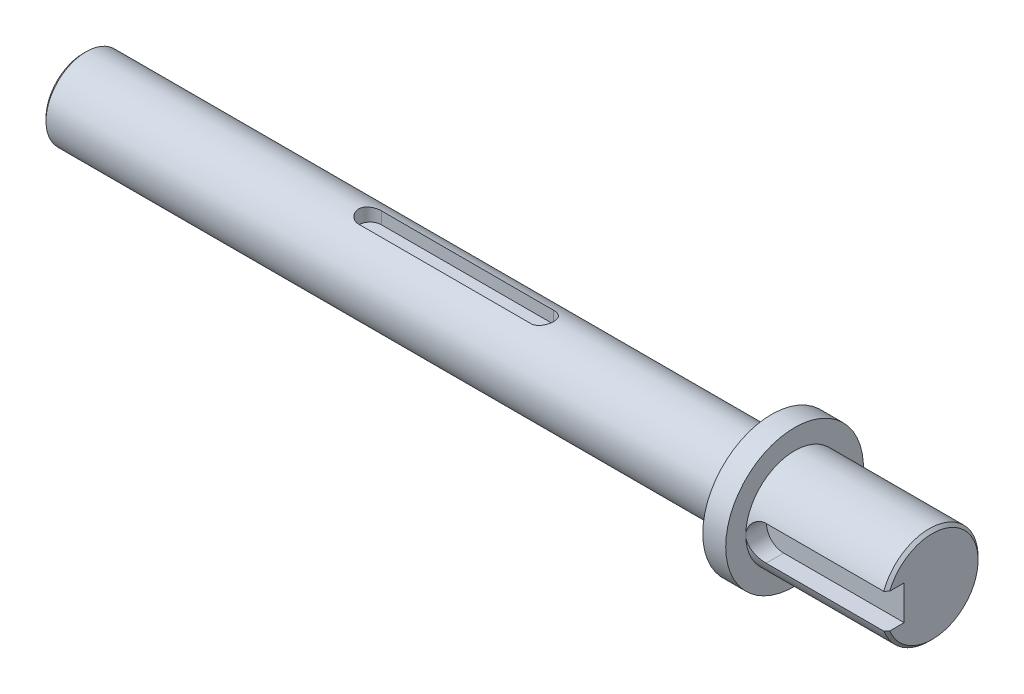
ISO-10303-21;
HEADER;
FILE_DESCRIPTION(('STEP AP214'),'2;1');
FILE_NAME('part.step','',(''),(''),'','','');
FILE_SCHEMA(('AUTOMOTIVE_DESIGN { 1 0 10303 214 1 1 1 1 }'));
ENDSEC;
DATA;
#1=APPLICATION_CONTEXT('core data for automotive mechanical design processes');
#2=APPLICATION_PROTOCOL_DEFINITION('international standard','automotive_design',2000,#1);
#3=PRODUCT_CONTEXT('',#1,'mechanical');
#4=PRODUCT('Part','Part','',(#3));
#5=PRODUCT_RELATED_PRODUCT_CATEGORY('part','',(#4));
#6=PRODUCT_DEFINITION_FORMATION('','',#4);
#7=PRODUCT_DEFINITION_CONTEXT('part definition',#1,'design');
#8=PRODUCT_DEFINITION('design','',#6,#7);
#9=PRODUCT_DEFINITION_SHAPE('','',#8);
#10=(LENGTH_UNIT() NAMED_UNIT(*) SI_UNIT(.MILLI.,.METRE.));
#11=(NAMED_UNIT(*) PLANE_ANGLE_UNIT() SI_UNIT($,.RADIAN.));
#12=(NAMED_UNIT(*) SI_UNIT($,.STERADIAN.) SOLID_ANGLE_UNIT());
#13=UNCERTAINTY_MEASURE_WITH_UNIT(LENGTH_MEASURE(1.E-05),#10,'distance_accuracy_value','');
#14=(GEOMETRIC_REPRESENTATION_CONTEXT(3) GLOBAL_UNCERTAINTY_ASSIGNED_CONTEXT((#13)) GLOBAL_UNIT_ASSIGNED_CONTEXT((#10,
#11,#12)) REPRESENTATION_CONTEXT('',''));
#15=CARTESIAN_POINT('',(0.,0.,0.));
#16=DIRECTION('',(0.,0.,1.));
#17=DIRECTION('',(1.,0.,0.));
#18=AXIS2_PLACEMENT_3D('',#15,#16,#17);
#19=CARTESIAN_POINT('',(61.9999999999998,0.,0.));
#20=DIRECTION('',(0.999999999999997,0.,0.));
#21=DIRECTION('',(0.,0.,-0.999999999999999));
#22=AXIS2_PLACEMENT_3D('',#19,#20,#21);
#23=PLANE('',#22);
#24=CARTESIAN_POINT('',(61.9999999999998,0.,0.));
#25=DIRECTION('',(0.999999999999997,0.,0.));
#26=DIRECTION('',(0.,0.,-0.999999999999999));
#27=AXIS2_PLACEMENT_3D('',#24,#25,#26);
#28=CIRCLE('',#27,6.);
#29=CARTESIAN_POINT('',(61.9999999999998,0.,6.00000000000001));
#30=VERTEX_POINT('',#29);
#31=EDGE_CURVE('E1997',#30,#30,#28,.T.);
#32=ORIENTED_EDGE('',*,*,#31,.T.);
#33=EDGE_LOOP('',(#32));
#34=FACE_BOUND('',#33,.T.);
#35=CARTESIAN_POINT('',(61.9999999999998,0.,0.));
#36=DIRECTION('',(0.999999999999997,0.,0.));
#37=DIRECTION('',(0.,0.,-0.999999999999999));
#38=AXIS2_PLACEMENT_3D('',#35,#36,#37);
#39=CIRCLE('',#38,4.25);
#40=CARTESIAN_POINT('',(61.9999999999998,0.,4.24999999999999));
#41=VERTEX_POINT('',#40);
#42=EDGE_CURVE('E1993',#41,#41,#39,.T.);
#43=ORIENTED_EDGE('',*,*,#42,.F.);
#44=EDGE_LOOP('',(#43));
#45=FACE_BOUND('',#44,.T.);
#46=ADVANCED_FACE('F1889',(#34,#45),#23,.T.);
#47=CARTESIAN_POINT('',(59.9999999999998,0.,0.));
#48=DIRECTION('',(-0.999999999999997,0.,0.));
#49=DIRECTION('',(0.,0.,0.999999999999999));
#50=AXIS2_PLACEMENT_3D('',#47,#48,#49);
#51=CYLINDRICAL_SURFACE('',#50,3.5);
#52=CARTESIAN_POINT('',(0.254000000000004,0.,0.));
#53=DIRECTION('',(0.999999999999997,0.,0.));
#54=DIRECTION('',(0.,1.,0.));
#55=AXIS2_PLACEMENT_3D('',#52,#53,#54);
#56=CIRCLE('',#55,3.5);
#57=CARTESIAN_POINT('',(0.254000000000004,3.50000000000001,0.));
#58=VERTEX_POINT('',#57);
#59=EDGE_CURVE('E1897',#58,#58,#56,.T.);
#60=ORIENTED_EDGE('',*,*,#59,.T.);
#61=EDGE_LOOP('',(#60));
#62=FACE_BOUND('',#61,.T.);
#63=DIRECTION('',(-0.999999999999997,0.,0.));
#64=VECTOR('',#63,1.);
#65=CARTESIAN_POINT('',(59.9999999999998,3.35410196624966,-0.999999999999966));
#66=LINE('',#65,#64);
#67=CARTESIAN_POINT('',(24.9999999999999,3.35410196624962,-0.999999999999945));
#68=VERTEX_POINT('',#67);
#69=CARTESIAN_POINT('',(39.9999999999998,3.35410196624963,-0.999999999999938));
#70=VERTEX_POINT('',#69);
#71=EDGE_CURVE('E2102',#68,#70,#66,.F.);
#72=ORIENTED_EDGE('',*,*,#71,.T.);
#73=CARTESIAN_POINT('',(39.9999999999998,3.35410196624963,-0.999999999999938));
#74=CARTESIAN_POINT('',(40.0275170249073,3.35409976658489,-1.00000049850504));
#75=CARTESIAN_POINT('',(40.0550202597347,3.35444102034785,-0.998863493287122));
#76=CARTESIAN_POINT('',(40.1098181033839,3.35578786459356,-0.994332009888068));
#77=CARTESIAN_POINT('',(40.13711275428,3.35679331731787,-0.990937999820926));
#78=CARTESIAN_POINT('',(40.2182537496953,3.3607637503994,-0.977425314705586));
#79=CARTESIAN_POINT('',(40.271537817037,3.36468309657149,-0.963975716618307));
#80=CARTESIAN_POINT('',(40.3749700144543,3.37460265056327,-0.928648815906223));
#81=CARTESIAN_POINT('',(40.4251189911292,3.38060229373007,-0.906773800005629));
#82=CARTESIAN_POINT('',(40.5210683200398,3.39400252324993,-0.855250482454198));
#83=CARTESIAN_POINT('',(40.5668668974156,3.40140367773156,-0.825599026596337));
#84=CARTESIAN_POINT('',(40.6540953815057,3.417008711168,-0.758463189713928));
#85=CARTESIAN_POINT('',(40.6953820675197,3.42522837538693,-0.720796434289667));
#86=CARTESIAN_POINT('',(40.7711495263554,3.44140944203541,-0.639087782954265));
#87=CARTESIAN_POINT('',(40.8056291705062,3.44937080145304,-0.595044831905301));
#88=CARTESIAN_POINT('',(40.867415070698,3.46431682750155,-0.500821950623839));
#89=CARTESIAN_POINT('',(40.8945760360544,3.47128058280444,-0.450543143150278));
#90=CARTESIAN_POINT('',(40.9400016912479,3.48326292773679,-0.345901809951445));
#91=CARTESIAN_POINT('',(40.9582685086113,3.48828198248995,-0.291540264432963));
#92=CARTESIAN_POINT('',(40.9849170938374,3.49569755735467,-0.181779864220418));
#93=CARTESIAN_POINT('',(40.993544329113,3.49815908311015,-0.126445076386613));
#94=CARTESIAN_POINT('',(41.0014433806284,3.50041048233727,-0.0150612429205157));
#95=CARTESIAN_POINT('',(41.0007167870586,3.50020080992392,0.0409876796873295));
#96=CARTESIAN_POINT('',(40.9900967865966,3.49718002611492,0.150490378803021));
#97=CARTESIAN_POINT('',(40.9804690968913,3.49444432518677,0.203972329131943));
#98=CARTESIAN_POINT('',(40.9527522573651,3.48676938053402,0.308526642102544));
#99=CARTESIAN_POINT('',(40.9346626803644,3.48183002556336,0.359598882952007));
#100=CARTESIAN_POINT('',(40.8903451327294,3.47019511125505,0.458537318553586));
#101=CARTESIAN_POINT('',(40.8640302352284,3.46348091788377,0.506362294335574));
#102=CARTESIAN_POINT('',(40.804077108853,3.44901371958342,0.597004321590939));
#103=CARTESIAN_POINT('',(40.7704373935808,3.44126050393243,0.639820353903317));
#104=CARTESIAN_POINT('',(40.6954012019748,3.42522923719646,0.720812145758794));
#105=CARTESIAN_POINT('',(40.6537744565457,3.41694231453103,0.758773058684924));
#106=CARTESIAN_POINT('',(40.5646513518632,3.40101643089073,0.827240355260717));
#107=CARTESIAN_POINT('',(40.517153333656,3.39337765408521,0.857744624720471));
#108=CARTESIAN_POINT('',(40.4171063869065,3.37957156162491,0.910632887034027));
#109=CARTESIAN_POINT('',(40.364517948151,3.37341730876615,0.932945634858298));
#110=CARTESIAN_POINT('',(40.2561439679437,3.36343812734786,0.968311532076177));
#111=CARTESIAN_POINT('',(40.200363411695,3.35960966960776,0.981378715751715));
#112=CARTESIAN_POINT('',(40.1200602690919,3.35616467475821,0.993060108315523));
#113=CARTESIAN_POINT('',(40.0961103225749,3.35539270208152,0.995662513878955));
#114=CARTESIAN_POINT('',(40.048110887356,3.35436137521795,0.999130770524125));
#115=CARTESIAN_POINT('',(40.024061606792,3.35410123920009,0.999999270178598));
#116=CARTESIAN_POINT('',(39.9999999999998,3.3541019662497,1.00000000000005));
#117=B_SPLINE_CURVE_WITH_KNOTS('',3,(#73,#74,#75,#76,#77,#78,#79,#80,#81,#82,#83,#84,#85,#86,
#87,#88,#89,#90,#91,#92,#93,#94,#95,#96,#97,#98,#99,#100,#101,#102,#103,#104,#105,#106,#107,
#108,#109,#110,#111,#112,#113,#114,#115,#116),.UNSPECIFIED.,.F.,.F.,(4,2,2,2,2,2,2,2,2,2,2,2,2,
2,2,2,2,2,2,2,2,4),(0.,0.0824984357609256,0.164979766271604,0.329407523681637,0.493790685524954,
0.658240626330405,0.826933952896829,0.995655226942902,1.16751346138037,1.33933056621712,
1.50666495361955,1.67397089384636,1.83643825095367,1.99891381075505,2.1631680675018,
2.32745568686297,2.49749310251656,2.66757867328184,2.83911034045411,3.0103810696682,
3.08263487199164,3.15477822061624),.UNSPECIFIED.);
#118=CARTESIAN_POINT('',(39.9999999999998,3.3541019662497,1.00000000000005));
#119=VERTEX_POINT('',#118);
#120=EDGE_CURVE('E2029',#70,#119,#117,.T.);
#121=ORIENTED_EDGE('',*,*,#120,.T.);
#122=DIRECTION('',(-0.999999999999997,0.,0.));
#123=VECTOR('',#122,1.);
#124=CARTESIAN_POINT('',(59.9999999999998,3.3541019662497,1.00000000000005));
#125=LINE('',#124,#123);
#126=CARTESIAN_POINT('',(24.9999999999999,3.3541019662497,1.00000000000006));
#127=VERTEX_POINT('',#126);
#128=EDGE_CURVE('E2099',#119,#127,#125,.T.);
#129=ORIENTED_EDGE('',*,*,#128,.T.);
#130=CARTESIAN_POINT('',(24.9999999999999,3.3541019662497,1.00000000000006));
#131=CARTESIAN_POINT('',(24.9724829750924,3.35409976658494,1.00000049850502));
#132=CARTESIAN_POINT('',(24.9449797402651,3.35444102034789,0.99886349328704));
#133=CARTESIAN_POINT('',(24.8901818966158,3.3557878645936,0.994332009887932));
#134=CARTESIAN_POINT('',(24.8628872457197,3.35679331731791,0.990937999820801));
#135=CARTESIAN_POINT('',(24.7817462503044,3.36076375039944,0.977425314705519));
#136=CARTESIAN_POINT('',(24.7284621829627,3.36468309657151,0.963975716618312));
#137=CARTESIAN_POINT('',(24.6250299855454,3.37460265056328,0.928648815906218));
#138=CARTESIAN_POINT('',(24.5748810088706,3.38060229373008,0.906773800005542));
#139=CARTESIAN_POINT('',(24.47893167996,3.39400252324997,0.855250482454118));
#140=CARTESIAN_POINT('',(24.4331331025841,3.40140367773163,0.825599026596347));
#141=CARTESIAN_POINT('',(24.345904618494,3.41700871116806,0.758463189713963));
#142=CARTESIAN_POINT('',(24.3046179324801,3.42522837538695,0.720796434289633));
#143=CARTESIAN_POINT('',(24.2288504736443,3.44140944203541,0.639087782954233));
#144=CARTESIAN_POINT('',(24.1943708294935,3.44937080145305,0.595044831905338));
#145=CARTESIAN_POINT('',(24.1325849293017,3.46431682750156,0.500821950623916));
#146=CARTESIAN_POINT('',(24.1054239639454,3.47128058280444,0.450543143150323));
#147=CARTESIAN_POINT('',(24.0599983087519,3.48326292773679,0.345901809951497));
#148=CARTESIAN_POINT('',(24.0417314913884,3.48828198248999,0.291540264433054));
#149=CARTESIAN_POINT('',(24.0150829061623,3.4956975573547,0.181779864220535));
#150=CARTESIAN_POINT('',(24.0064556708867,3.49815908311014,0.126445076386715));
#151=CARTESIAN_POINT('',(23.9985566193713,3.50041048233727,0.0150612429206066));
#152=CARTESIAN_POINT('',(23.9992832129412,3.50020080992397,-0.0409876796872369));
#153=CARTESIAN_POINT('',(24.0099032134031,3.49718002611498,-0.150490378802941));
#154=CARTESIAN_POINT('',(24.0195309031083,3.49444432518679,-0.203972329131878));
#155=CARTESIAN_POINT('',(24.0472477426345,3.48676938053401,-0.308526642102469));
#156=CARTESIAN_POINT('',(24.0653373196353,3.48183002556335,-0.359598882951907));
#157=CARTESIAN_POINT('',(24.1096548672703,3.47019511125504,-0.458537318553518));
#158=CARTESIAN_POINT('',(24.1359697647712,3.46348091788376,-0.506362294335561));
#159=CARTESIAN_POINT('',(24.1959228911466,3.44901371958342,-0.597004321590945));
#160=CARTESIAN_POINT('',(24.2295626064188,3.44126050393245,-0.639820353903288));
#161=CARTESIAN_POINT('',(24.3045987980249,3.42522923719645,-0.720812145758789));
#162=CARTESIAN_POINT('',(24.3462255434539,3.41694231453099,-0.758773058684985));
#163=CARTESIAN_POINT('',(24.4353486481364,3.40101643089073,-0.827240355260782));
#164=CARTESIAN_POINT('',(24.4828466663437,3.39337765408529,-0.857744624720473));
#165=CARTESIAN_POINT('',(24.5828936130931,3.37957156162497,-0.910632887034065));
#166=CARTESIAN_POINT('',(24.6354820518487,3.3734173087661,-0.932945634858437));
#167=CARTESIAN_POINT('',(24.7438560320559,3.36343812734784,-0.968311532076234));
#168=CARTESIAN_POINT('',(24.7996365883047,3.35960966960788,-0.98137871575159));
#169=CARTESIAN_POINT('',(24.8799397309077,3.35616467475826,-0.993060108315528));
#170=CARTESIAN_POINT('',(24.9038896774248,3.35539270208152,-0.995662513879046));
#171=CARTESIAN_POINT('',(24.9518891126436,3.35436137521788,-0.999130770524253));
#172=CARTESIAN_POINT('',(24.9759383932077,3.3541012392,-0.999999270178677));
#173=CARTESIAN_POINT('',(24.9999999999999,3.35410196624965,-0.999999999999897));
#174=B_SPLINE_CURVE_WITH_KNOTS('',3,(#130,#131,#132,#133,#134,#135,#136,#137,#138,#139,#140,
#141,#142,#143,#144,#145,#146,#147,#148,#149,#150,#151,#152,#153,#154,#155,#156,#157,#158,#159,
#160,#161,#162,#163,#164,#165,#166,#167,#168,#169,#170,#171,#172,#173),.UNSPECIFIED.,.F.,.F.,(4,
2,2,2,2,2,2,2,2,2,2,2,2,2,2,2,2,2,2,2,2,4),(0.,0.0824984357608964,0.164979766271582,
0.329407523681617,0.493790685524924,0.658240626330365,0.826933952896761,0.995655226942814,
1.16751346138026,1.33933056621697,1.5066649536194,1.67397089384623,1.83643825095354,
1.99891381075491,2.1631680675017,2.32745568686291,2.49749310251651,2.66757867328181,
2.83911034045408,3.01038106966817,3.08263487199162,3.15477822061623),.UNSPECIFIED.);
#175=EDGE_CURVE('E2038',#127,#68,#174,.T.);
#176=ORIENTED_EDGE('',*,*,#175,.T.);
#177=EDGE_LOOP('',(#72,#121,#129,#176));
#178=FACE_BOUND('',#177,.T.);
#179=CARTESIAN_POINT('',(59.9999999999998,0.,0.));
#180=DIRECTION('',(0.999999999999997,0.,0.));
#181=DIRECTION('',(0.,0.,-0.999999999999999));
#182=AXIS2_PLACEMENT_3D('',#179,#180,#181);
#183=CIRCLE('',#182,3.5);
#184=CARTESIAN_POINT('',(59.9999999999998,0.,-3.49999999999998));
#185=VERTEX_POINT('',#184);
#186=EDGE_CURVE('E2018',#185,#185,#183,.T.);
#187=ORIENTED_EDGE('',*,*,#186,.F.);
#188=EDGE_LOOP('',(#187));
#189=FACE_BOUND('',#188,.T.);
#190=ADVANCED_FACE('F2045',(#62,#178,#189),#51,.T.);
#191=CARTESIAN_POINT('',(0.,0.,0.));
#192=DIRECTION('',(0.999999999999997,0.,0.));
#193=DIRECTION('',(0.,0.,-0.999999999999999));
#194=AXIS2_PLACEMENT_3D('',#191,#192,#193);
#195=PLANE('',#194);
#196=CARTESIAN_POINT('',(0.,0.,0.));
#197=DIRECTION('',(0.999999999999997,0.,0.));
#198=DIRECTION('',(0.,1.,0.));
#199=AXIS2_PLACEMENT_3D('',#196,#197,#198);
#200=CIRCLE('',#199,3.246);
#201=CARTESIAN_POINT('',(0.,3.24600000000001,0.));
#202=VERTEX_POINT('',#201);
#203=EDGE_CURVE('E14',#202,#202,#200,.F.);
#204=ORIENTED_EDGE('',*,*,#203,.T.);
#205=EDGE_LOOP('',(#204));
#206=FACE_BOUND('',#205,.T.);
#207=ADVANCED_FACE('F2063',(#206),#195,.F.);
#208=CARTESIAN_POINT('',(24.9999999999999,2.29999999999994,0.));
#209=DIRECTION('',(0.,1.,0.));
#210=DIRECTION('',(0.,0.,0.999999999999999));
#211=AXIS2_PLACEMENT_3D('',#208,#209,#210);
#212=CYLINDRICAL_SURFACE('',#211,1.);
#213=DIRECTION('',(0.,1.,0.));
#214=VECTOR('',#213,1.);
#215=CARTESIAN_POINT('',(24.9999999999999,2.29999999999997,1.00000000000008));
#216=LINE('',#215,#214);
#217=CARTESIAN_POINT('',(24.9999999999999,2.29999999999997,1.00000000000008));
#218=VERTEX_POINT('',#217);
#219=EDGE_CURVE('E2014',#218,#127,#216,.T.);
#220=ORIENTED_EDGE('',*,*,#219,.F.);
#221=CARTESIAN_POINT('',(24.9999999999999,2.29999999999994,0.));
#222=DIRECTION('',(0.,1.,0.));
#223=DIRECTION('',(0.,0.,0.999999999999999));
#224=AXIS2_PLACEMENT_3D('',#221,#222,#223);
#225=CIRCLE('',#224,1.);
#226=CARTESIAN_POINT('',(24.9999999999999,2.30000000000001,-0.999999999999987));
#227=VERTEX_POINT('',#226);
#228=EDGE_CURVE('E2000',#227,#218,#225,.T.);
#229=ORIENTED_EDGE('',*,*,#228,.F.);
#230=DIRECTION('',(0.,1.,0.));
#231=VECTOR('',#230,1.);
#232=CARTESIAN_POINT('',(24.9999999999999,2.30000000000001,-0.999999999999987));
#233=LINE('',#232,#231);
#234=EDGE_CURVE('E2015',#227,#68,#233,.T.);
#235=ORIENTED_EDGE('',*,*,#234,.T.);
#236=ORIENTED_EDGE('',*,*,#175,.F.);
#237=EDGE_LOOP('',(#220,#229,#235,#236));
#238=FACE_BOUND('',#237,.T.);
#239=ADVANCED_FACE('F2060',(#238),#212,.F.);
#240=CARTESIAN_POINT('',(24.9999999999999,2.30000000000001,-0.999999999999987));
#241=DIRECTION('',(0.,0.,-0.999999999999999));
#242=DIRECTION('',(-0.999999999999997,0.,0.));
#243=AXIS2_PLACEMENT_3D('',#240,#241,#242);
#244=PLANE('',#243);
#245=ORIENTED_EDGE('',*,*,#234,.F.);
#246=DIRECTION('',(-0.999999999999997,0.,0.));
#247=VECTOR('',#246,1.);
#248=CARTESIAN_POINT('',(24.9999999999999,2.30000000000001,-0.999999999999987));
#249=LINE('',#248,#247);
#250=CARTESIAN_POINT('',(39.9999999999998,2.30000000000002,-1.00000000000004));
#251=VERTEX_POINT('',#250);
#252=EDGE_CURVE('E2011',#251,#227,#249,.T.);
#253=ORIENTED_EDGE('',*,*,#252,.F.);
#254=DIRECTION('',(0.,1.,0.));
#255=VECTOR('',#254,1.);
#256=CARTESIAN_POINT('',(39.9999999999998,2.30000000000002,-1.00000000000004));
#257=LINE('',#256,#255);
#258=EDGE_CURVE('E2019',#251,#70,#257,.T.);
#259=ORIENTED_EDGE('',*,*,#258,.T.);
#260=ORIENTED_EDGE('',*,*,#71,.F.);
#261=EDGE_LOOP('',(#245,#253,#259,#260));
#262=FACE_BOUND('',#261,.T.);
#263=ADVANCED_FACE('F2054',(#262),#244,.F.);
#264=CARTESIAN_POINT('',(39.9999999999998,2.29999999999994,0.));
#265=DIRECTION('',(0.,1.,0.));
#266=DIRECTION('',(0.,0.,0.999999999999999));
#267=AXIS2_PLACEMENT_3D('',#264,#265,#266);
#268=CYLINDRICAL_SURFACE('',#267,1.);
#269=ORIENTED_EDGE('',*,*,#258,.F.);
#270=CARTESIAN_POINT('',(39.9999999999998,2.29999999999994,0.));
#271=DIRECTION('',(0.,1.,0.));
#272=DIRECTION('',(0.,0.,0.999999999999999));
#273=AXIS2_PLACEMENT_3D('',#270,#271,#272);
#274=CIRCLE('',#273,1.);
#275=CARTESIAN_POINT('',(39.9999999999998,2.29999999999998,1.00000000000006));
#276=VERTEX_POINT('',#275);
#277=EDGE_CURVE('E2008',#276,#251,#274,.T.);
#278=ORIENTED_EDGE('',*,*,#277,.F.);
#279=DIRECTION('',(0.,1.,0.));
#280=VECTOR('',#279,1.);
#281=CARTESIAN_POINT('',(39.9999999999998,2.29999999999998,1.00000000000006));
#282=LINE('',#281,#280);
#283=EDGE_CURVE('E2022',#276,#119,#282,.T.);
#284=ORIENTED_EDGE('',*,*,#283,.T.);
#285=ORIENTED_EDGE('',*,*,#120,.F.);
#286=EDGE_LOOP('',(#269,#278,#284,#285));
#287=FACE_BOUND('',#286,.T.);
#288=ADVANCED_FACE('F2048',(#287),#268,.F.);
#289=CARTESIAN_POINT('',(24.9999999999999,2.29999999999997,1.00000000000008));
#290=DIRECTION('',(0.,0.,0.999999999999999));
#291=DIRECTION('',(0.999999999999997,0.,0.));
#292=AXIS2_PLACEMENT_3D('',#289,#290,#291);
#293=PLANE('',#292);
#294=ORIENTED_EDGE('',*,*,#283,.F.);
#295=DIRECTION('',(0.999999999999997,0.,0.));
#296=VECTOR('',#295,1.);
#297=CARTESIAN_POINT('',(24.9999999999999,2.29999999999997,1.00000000000008));
#298=LINE('',#297,#296);
#299=EDGE_CURVE('E2005',#218,#276,#298,.T.);
#300=ORIENTED_EDGE('',*,*,#299,.F.);
#301=ORIENTED_EDGE('',*,*,#219,.T.);
#302=ORIENTED_EDGE('',*,*,#128,.F.);
#303=EDGE_LOOP('',(#294,#300,#301,#302));
#304=FACE_BOUND('',#303,.T.);
#305=ADVANCED_FACE('F2053',(#304),#293,.F.);
#306=CARTESIAN_POINT('',(24.9999999999999,2.29999999999994,0.));
#307=DIRECTION('',(0.,1.,0.));
#308=DIRECTION('',(0.,0.,0.999999999999999));
#309=AXIS2_PLACEMENT_3D('',#306,#307,#308);
#310=PLANE('',#309);
#311=ORIENTED_EDGE('',*,*,#228,.T.);
#312=ORIENTED_EDGE('',*,*,#299,.T.);
#313=ORIENTED_EDGE('',*,*,#277,.T.);
#314=ORIENTED_EDGE('',*,*,#252,.T.);
#315=EDGE_LOOP('',(#311,#312,#313,#314));
#316=FACE_BOUND('',#315,.T.);
#317=ADVANCED_FACE('F2058',(#316),#310,.T.);
#318=CARTESIAN_POINT('',(59.9999999999998,0.,0.));
#319=DIRECTION('',(0.999999999999997,0.,0.));
#320=DIRECTION('',(0.,0.,-0.999999999999999));
#321=AXIS2_PLACEMENT_3D('',#318,#319,#320);
#322=PLANE('',#321);
#323=CARTESIAN_POINT('',(59.9999999999998,0.,0.));
#324=DIRECTION('',(0.999999999999997,0.,0.));
#325=DIRECTION('',(0.,0.,-0.999999999999999));
#326=AXIS2_PLACEMENT_3D('',#323,#324,#325);
#327=CIRCLE('',#326,6.);
#328=CARTESIAN_POINT('',(59.9999999999998,0.,6.00000000000001));
#329=VERTEX_POINT('',#328);
#330=EDGE_CURVE('E1996',#329,#329,#327,.T.);
#331=ORIENTED_EDGE('',*,*,#330,.F.);
#332=EDGE_LOOP('',(#331));
#333=FACE_BOUND('',#332,.T.);
#334=ORIENTED_EDGE('',*,*,#186,.T.);
#335=EDGE_LOOP('',(#334));
#336=FACE_BOUND('',#335,.T.);
#337=ADVANCED_FACE('F2082',(#333,#336),#322,.F.);
#338=CARTESIAN_POINT('',(61.9999999999998,0.,0.));
#339=DIRECTION('',(-0.999999999999997,0.,0.));
#340=DIRECTION('',(0.,0.,0.999999999999999));
#341=AXIS2_PLACEMENT_3D('',#338,#339,#340);
#342=CYLINDRICAL_SURFACE('',#341,6.);
#343=CARTESIAN_POINT('',(61.9999999999998,0.,6.00000000000001));
#344=CARTESIAN_POINT('',(61.9791666666665,0.,6.00000000000001));
#345=CARTESIAN_POINT('',(61.9583333333332,0.,6.00000000000001));
#346=CARTESIAN_POINT('',(61.9166666666665,0.,6.00000000000001));
#347=CARTESIAN_POINT('',(61.8958333333331,0.,6.00000000000001));
#348=CARTESIAN_POINT('',(61.8541666666665,0.,6.00000000000001));
#349=CARTESIAN_POINT('',(61.8333333333331,0.,6.00000000000001));
#350=CARTESIAN_POINT('',(61.7916666666665,0.,6.00000000000001));
#351=CARTESIAN_POINT('',(61.7708333333331,0.,6.00000000000001));
#352=CARTESIAN_POINT('',(61.7291666666665,0.,6.00000000000001));
#353=CARTESIAN_POINT('',(61.7083333333331,0.,6.00000000000001));
#354=CARTESIAN_POINT('',(61.6666666666665,0.,6.00000000000001));
#355=CARTESIAN_POINT('',(61.6458333333331,0.,6.00000000000001));
#356=CARTESIAN_POINT('',(61.6041666666665,0.,6.00000000000001));
#357=CARTESIAN_POINT('',(61.5833333333331,0.,6.00000000000001));
#358=CARTESIAN_POINT('',(61.5416666666665,0.,6.00000000000001));
#359=CARTESIAN_POINT('',(61.5208333333331,0.,6.00000000000001));
#360=CARTESIAN_POINT('',(61.4791666666665,0.,6.00000000000001));
#361=CARTESIAN_POINT('',(61.4583333333331,0.,6.00000000000001));
#362=CARTESIAN_POINT('',(61.4166666666665,0.,6.00000000000001));
#363=CARTESIAN_POINT('',(61.3958333333331,0.,6.00000000000001));
#364=CARTESIAN_POINT('',(61.3541666666665,0.,6.00000000000001));
#365=CARTESIAN_POINT('',(61.3333333333331,0.,6.00000000000001));
#366=CARTESIAN_POINT('',(61.2916666666665,0.,6.00000000000001));
#367=CARTESIAN_POINT('',(61.2708333333331,0.,6.00000000000001));
#368=CARTESIAN_POINT('',(61.2291666666665,0.,6.00000000000001));
#369=CARTESIAN_POINT('',(61.2083333333331,0.,6.00000000000001));
#370=CARTESIAN_POINT('',(61.1666666666665,0.,6.00000000000001));
#371=CARTESIAN_POINT('',(61.1458333333331,0.,6.00000000000001));
#372=CARTESIAN_POINT('',(61.1041666666665,0.,6.00000000000001));
#373=CARTESIAN_POINT('',(61.0833333333331,0.,6.00000000000001));
#374=CARTESIAN_POINT('',(61.0416666666665,0.,6.00000000000001));
#375=CARTESIAN_POINT('',(61.0208333333331,0.,6.00000000000001));
#376=CARTESIAN_POINT('',(60.9791666666665,0.,6.00000000000001));
#377=CARTESIAN_POINT('',(60.9583333333331,0.,6.00000000000001));
#378=CARTESIAN_POINT('',(60.9166666666665,0.,6.00000000000001));
#379=CARTESIAN_POINT('',(60.8958333333331,0.,6.00000000000001));
#380=CARTESIAN_POINT('',(60.8541666666665,0.,6.00000000000001));
#381=CARTESIAN_POINT('',(60.8333333333331,0.,6.00000000000001));
#382=CARTESIAN_POINT('',(60.7916666666665,0.,6.00000000000001));
#383=CARTESIAN_POINT('',(60.7708333333331,0.,6.00000000000001));
#384=CARTESIAN_POINT('',(60.7291666666665,0.,6.00000000000001));
#385=CARTESIAN_POINT('',(60.7083333333331,0.,6.00000000000001));
#386=CARTESIAN_POINT('',(60.6666666666665,0.,6.00000000000001));
#387=CARTESIAN_POINT('',(60.6458333333331,0.,6.00000000000001));
#388=CARTESIAN_POINT('',(60.6041666666665,0.,6.00000000000001));
#389=CARTESIAN_POINT('',(60.5833333333331,0.,6.00000000000001));
#390=CARTESIAN_POINT('',(60.5416666666665,0.,6.00000000000001));
#391=CARTESIAN_POINT('',(60.5208333333331,0.,6.00000000000001));
#392=CARTESIAN_POINT('',(60.4791666666665,0.,6.00000000000001));
#393=CARTESIAN_POINT('',(60.4583333333331,0.,6.00000000000001));
#394=CARTESIAN_POINT('',(60.4166666666665,0.,6.00000000000001));
#395=CARTESIAN_POINT('',(60.3958333333331,0.,6.00000000000001));
#396=CARTESIAN_POINT('',(60.3541666666665,0.,6.00000000000001));
#397=CARTESIAN_POINT('',(60.3333333333331,0.,6.00000000000001));
#398=CARTESIAN_POINT('',(60.2916666666665,0.,6.00000000000001));
#399=CARTESIAN_POINT('',(60.2708333333331,0.,6.00000000000001));
#400=CARTESIAN_POINT('',(60.2291666666665,0.,6.00000000000001));
#401=CARTESIAN_POINT('',(60.2083333333331,0.,6.00000000000001));
#402=CARTESIAN_POINT('',(60.1666666666665,0.,6.00000000000001));
#403=CARTESIAN_POINT('',(60.1458333333331,0.,6.00000000000001));
#404=CARTESIAN_POINT('',(60.1041666666665,0.,6.00000000000001));
#405=CARTESIAN_POINT('',(60.0833333333331,0.,6.00000000000001));
#406=CARTESIAN_POINT('',(60.0416666666665,0.,6.00000000000001));
#407=CARTESIAN_POINT('',(60.0208333333331,0.,6.00000000000001));
#408=CARTESIAN_POINT('',(59.9999999999998,0.,6.00000000000001));
#409=B_SPLINE_CURVE_WITH_KNOTS('',3,(#343,#344,#345,#346,#347,#348,#349,#350,#351,#352,#353,
#354,#355,#356,#357,#358,#359,#360,#361,#362,#363,#364,#365,#366,#367,#368,#369,#370,#371,#372,
#373,#374,#375,#376,#377,#378,#379,#380,#381,#382,#383,#384,#385,#386,#387,#388,#389,#390,#391,
#392,#393,#394,#395,#396,#397,#398,#399,#400,#401,#402,#403,#404,#405,#406,#407,#408),
.UNSPECIFIED.,.F.,.F.,(4,2,2,2,2,2,2,2,2,2,2,2,2,2,2,2,2,2,2,2,2,2,2,2,2,2,2,2,2,2,2,2,4),(0.,
0.062500000000007,0.125000000000007,0.187500000000007,0.250000000000007,0.312500000000007,
0.375000000000007,0.437500000000007,0.500000000000007,0.562500000000007,0.625000000000008,
0.687500000000008,0.750000000000008,0.812500000000008,0.875000000000008,0.937500000000008,
1.00000000000001,1.06250000000001,1.12500000000001,1.18750000000001,1.25000000000001,
1.31250000000001,1.37500000000001,1.43750000000001,1.50000000000001,1.56250000000001,
1.62500000000001,1.68750000000001,1.75000000000001,1.81250000000001,1.87500000000001,
1.93750000000001,2.00000000000001),.UNSPECIFIED.);
#410=EDGE_CURVE('BSEAM2085',#30,#329,#409,.T.);
#411=ORIENTED_EDGE('',*,*,#31,.F.);
#412=ORIENTED_EDGE('',*,*,#330,.T.);
#413=ORIENTED_EDGE('',*,*,#410,.T.);
#414=ORIENTED_EDGE('',*,*,#410,.F.);
#415=EDGE_LOOP('',(#411,#413,#412,#414));
#416=FACE_BOUND('',#415,.T.);
#417=ADVANCED_FACE('F2085',(#416),#342,.T.);
#418=CARTESIAN_POINT('',(73.9999999999996,0.,0.));
#419=DIRECTION('',(-0.999999999999997,0.,0.));
#420=DIRECTION('',(0.,0.,0.999999999999999));
#421=AXIS2_PLACEMENT_3D('',#418,#419,#420);
#422=CYLINDRICAL_SURFACE('',#421,4.25);
#423=DIRECTION('',(-0.999999999999997,0.,0.));
#424=VECTOR('',#423,1.);
#425=CARTESIAN_POINT('',(73.9999999999996,1.49999999999985,3.97649343014679));
#426=LINE('',#425,#424);
#427=CARTESIAN_POINT('',(63.4999999999996,1.49999999999985,3.97649343014679));
#428=VERTEX_POINT('',#427);
#429=CARTESIAN_POINT('',(73.7459999999996,1.49999999999985,3.97649343014679));
#430=VERTEX_POINT('',#429);
#431=EDGE_CURVE('E1977',#428,#430,#426,.F.);
#432=ORIENTED_EDGE('',*,*,#431,.T.);
#433=CARTESIAN_POINT('',(73.7459999999996,0.,0.));
#434=DIRECTION('',(0.999999999999997,0.,0.));
#435=DIRECTION('',(0.,1.,0.));
#436=AXIS2_PLACEMENT_3D('',#433,#434,#435);
#437=CIRCLE('',#436,4.25);
#438=CARTESIAN_POINT('',(73.7459999999996,-1.50000000000004,3.97649343014671));
#439=VERTEX_POINT('',#438);
#440=EDGE_CURVE('E1904',#430,#439,#437,.F.);
#441=ORIENTED_EDGE('',*,*,#440,.T.);
#442=DIRECTION('',(-0.999999999999997,0.,0.));
#443=VECTOR('',#442,1.);
#444=CARTESIAN_POINT('',(73.9999999999996,-1.50000000000004,3.97649343014671));
#445=LINE('',#444,#443);
#446=CARTESIAN_POINT('',(63.4999999999996,-1.50000000000004,3.97649343014671));
#447=VERTEX_POINT('',#446);
#448=EDGE_CURVE('E1991',#439,#447,#445,.T.);
#449=ORIENTED_EDGE('',*,*,#448,.T.);
#450=CARTESIAN_POINT('',(63.4999999999996,-1.50000000000004,3.97649343014671));
#451=CARTESIAN_POINT('',(63.4592188585709,-1.50000129258731,3.97648903120943));
#452=CARTESIAN_POINT('',(63.4184587198852,-1.49833582641152,3.97712157289233));
#453=CARTESIAN_POINT('',(63.3372580324426,-1.49170191493373,3.97961609473199));
#454=CARTESIAN_POINT('',(63.296817391587,-1.48673445944478,3.98147770645833));
#455=CARTESIAN_POINT('',(63.1766889805925,-1.4669784537341,3.98881964334666));
#456=CARTESIAN_POINT('',(63.0978503096134,-1.44733566055808,3.99605781233962));
#457=CARTESIAN_POINT('',(62.9448694078334,-1.39583412786629,4.01433453571204));
#458=CARTESIAN_POINT('',(62.8707240935516,-1.36398350787707,4.02537056360686));
#459=CARTESIAN_POINT('',(62.7287551578673,-1.28904148912628,4.04999062702012));
#460=CARTESIAN_POINT('',(62.6609362942433,-1.24594172154226,4.06357655742014));
#461=CARTESIAN_POINT('',(62.5306392096956,-1.14771886588996,4.09242690453434));
#462=CARTESIAN_POINT('',(62.4684793642728,-1.09218681171524,4.10773651445352));
#463=CARTESIAN_POINT('',(62.3541302582094,-0.971540676109632,4.13793076443851));
#464=CARTESIAN_POINT('',(62.3019430740764,-0.906424604080143,4.15281531545095));
#465=CARTESIAN_POINT('',(62.2075156755372,-0.766061704591716,4.18101895366017));
#466=CARTESIAN_POINT('',(62.1656208239724,-0.690569565938086,4.194277683613));
#467=CARTESIAN_POINT('',(62.0952799344175,-0.533086991690182,4.21718263330392));
#468=CARTESIAN_POINT('',(62.0668205372264,-0.451103106145981,4.22683243949022));
#469=CARTESIAN_POINT('',(62.0305230853025,-0.307319596139104,4.23929916682671));
#470=CARTESIAN_POINT('',(62.0191074921338,-0.246501411829576,4.24328330247949));
#471=CARTESIAN_POINT('',(62.0038344415389,-0.123802889374249,4.24864667529593));
#472=CARTESIAN_POINT('',(61.9999782100802,-0.0619223805833469,4.25002548993072));
#473=CARTESIAN_POINT('',(61.9999999999998,0.,4.24999999999999));
#474=B_SPLINE_CURVE_WITH_KNOTS('',3,(#450,#451,#452,#453,#454,#455,#456,#457,#458,#459,#460,
#461,#462,#463,#464,#465,#466,#467,#468,#469,#470,#471,#472,#473),.UNSPECIFIED.,.F.,.F.,(4,2,2,
2,2,2,2,2,2,2,2,4),(0.,0.122263636557292,0.244490639561452,0.487925282945371,0.731198296111067,
0.974652811089047,1.22776028524023,1.48092040414345,1.74167504174691,2.00216985568668,
2.18769580213593,2.37325183445214),.UNSPECIFIED.);
#475=EDGE_CURVE('E2111',#447,#41,#474,.T.);
#476=ORIENTED_EDGE('',*,*,#475,.T.);
#477=ORIENTED_EDGE('',*,*,#42,.T.);
#478=CARTESIAN_POINT('',(61.9999999999998,0.,4.24999999999999));
#479=CARTESIAN_POINT('',(61.9999989200347,0.0408613652337153,4.2500031730673));
#480=CARTESIAN_POINT('',(62.0016707424175,0.081702011755735,4.24941001666094));
#481=CARTESIAN_POINT('',(62.0083313568787,0.163068397972704,4.2470649846882));
#482=CARTESIAN_POINT('',(62.0133193239817,0.203594213453739,4.24531339731158));
#483=CARTESIAN_POINT('',(62.0331641544366,0.324008608891053,4.23838932225577));
#484=CARTESIAN_POINT('',(62.0529024765106,0.403054271207367,4.23154698992842));
#485=CARTESIAN_POINT('',(62.1046815738278,0.556462044022274,4.21412222126247));
#486=CARTESIAN_POINT('',(62.1367169051249,0.630826210108996,4.20354144011809));
#487=CARTESIAN_POINT('',(62.2120916281212,0.773162325988827,4.17970472266047));
#488=CARTESIAN_POINT('',(62.2554377725137,0.841130424157755,4.16644718936695));
#489=CARTESIAN_POINT('',(62.3539230234562,0.971285611614164,4.13807889743094));
#490=CARTESIAN_POINT('',(62.409415387662,1.03319473811176,4.12292019669977));
#491=CARTESIAN_POINT('',(62.5298761619579,1.14705311098065,4.09270633728756));
#492=CARTESIAN_POINT('',(62.5948477400284,1.19899901412759,4.07765121499107));
#493=CARTESIAN_POINT('',(62.7350517343538,1.29314300219275,4.04880134685824));
#494=CARTESIAN_POINT('',(62.8105538004597,1.33495885960582,4.03506526995055));
#495=CARTESIAN_POINT('',(62.9680470128986,1.4051477185436,4.01116464979118));
#496=CARTESIAN_POINT('',(63.0500306417028,1.43353603436981,4.00099604122805));
#497=CARTESIAN_POINT('',(63.1936270607198,1.46966510291005,3.98783738104401));
#498=CARTESIAN_POINT('',(63.254243404979,1.48100759734753,3.98362029756285));
#499=CARTESIAN_POINT('',(63.3765578090588,1.49618777258254,3.97793154168464));
#500=CARTESIAN_POINT('',(63.4382563072937,1.50002233735066,3.97646100920522));
#501=CARTESIAN_POINT('',(63.4999999999997,1.49999999999985,3.97649343014679));
#502=B_SPLINE_CURVE_WITH_KNOTS('',3,(#478,#479,#480,#481,#482,#483,#484,#485,#486,#487,#488,
#489,#490,#491,#492,#493,#494,#495,#496,#497,#498,#499,#500,#501),.UNSPECIFIED.,.F.,.F.,(4,2,2,
2,2,2,2,2,2,2,2,4),(0.,0.122505095004889,0.244979725146582,0.488981361847873,0.732875102179957,
0.976914784516303,1.2293182594919,1.48180628248345,1.74270259376251,2.00330062730608,
2.18823743729172,2.37325098567507),.UNSPECIFIED.);
#503=EDGE_CURVE('E2119',#41,#428,#502,.T.);
#504=ORIENTED_EDGE('',*,*,#503,.T.);
#505=EDGE_LOOP('',(#432,#441,#449,#476,#477,#504));
#506=FACE_BOUND('',#505,.T.);
#507=ADVANCED_FACE('F2079',(#506),#422,.T.);
#508=CARTESIAN_POINT('',(73.9999999999996,0.,0.));
#509=DIRECTION('',(0.999999999999997,0.,0.));
#510=DIRECTION('',(0.,0.,-0.999999999999999));
#511=AXIS2_PLACEMENT_3D('',#508,#509,#510);
#512=PLANE('',#511);
#513=DIRECTION('',(0.,0.,-0.999999999999999));
#514=VECTOR('',#513,1.);
#515=CARTESIAN_POINT('',(73.9999999999996,-1.50000000000006,0.));
#516=LINE('',#515,#514);
#517=CARTESIAN_POINT('',(73.9999999999996,-1.50000000000004,3.70378401098123));
#518=VERTEX_POINT('',#517);
#519=CARTESIAN_POINT('',(73.9999999999996,-1.50000000000004,2.44999999999995));
#520=VERTEX_POINT('',#519);
#521=EDGE_CURVE('E2109',#518,#520,#516,.T.);
#522=ORIENTED_EDGE('',*,*,#521,.F.);
#523=CARTESIAN_POINT('',(73.9999999999996,0.,0.));
#524=DIRECTION('',(0.999999999999997,0.,0.));
#525=DIRECTION('',(0.,1.,0.));
#526=AXIS2_PLACEMENT_3D('',#523,#524,#525);
#527=CIRCLE('',#526,3.99599999999999);
#528=CARTESIAN_POINT('',(73.9999999999996,1.49999999999999,3.7037840109812));
#529=VERTEX_POINT('',#528);
#530=EDGE_CURVE('E2142',#518,#529,#527,.T.);
#531=ORIENTED_EDGE('',*,*,#530,.T.);
#532=DIRECTION('',(0.,0.,0.999999999999999));
#533=VECTOR('',#532,1.);
#534=CARTESIAN_POINT('',(73.9999999999996,1.50000000000002,0.));
#535=LINE('',#534,#533);
#536=CARTESIAN_POINT('',(73.9999999999996,1.50000000000003,2.4500000000001));
#537=VERTEX_POINT('',#536);
#538=EDGE_CURVE('E2105',#537,#529,#535,.T.);
#539=ORIENTED_EDGE('',*,*,#538,.F.);
#540=DIRECTION('',(0.,-1.,0.));
#541=VECTOR('',#540,1.);
#542=CARTESIAN_POINT('',(73.9999999999996,0.,2.45000000000004));
#543=LINE('',#542,#541);
#544=EDGE_CURVE('E1971',#537,#520,#543,.T.);
#545=ORIENTED_EDGE('',*,*,#544,.T.);
#546=EDGE_LOOP('',(#522,#531,#539,#545));
#547=FACE_BOUND('',#546,.T.);
#548=ADVANCED_FACE('F2130',(#547),#512,.T.);
#549=CARTESIAN_POINT('',(63.4999999999996,0.,2.45000000000005));
#550=DIRECTION('',(0.,0.,0.999999999999999));
#551=DIRECTION('',(0.999999999999997,0.,0.));
#552=AXIS2_PLACEMENT_3D('',#549,#550,#551);
#553=CYLINDRICAL_SURFACE('',#552,1.5);
#554=ORIENTED_EDGE('',*,*,#475,.F.);
#555=DIRECTION('',(0.,0.,0.999999999999999));
#556=VECTOR('',#555,1.);
#557=CARTESIAN_POINT('',(63.4999999999996,-1.50000000000004,2.44999999999995));
#558=LINE('',#557,#556);
#559=CARTESIAN_POINT('',(63.4999999999996,-1.50000000000004,2.44999999999995));
#560=VERTEX_POINT('',#559);
#561=EDGE_CURVE('E1980',#560,#447,#558,.T.);
#562=ORIENTED_EDGE('',*,*,#561,.F.);
#563=CARTESIAN_POINT('',(63.4999999999996,0.,2.45000000000005));
#564=DIRECTION('',(0.,0.,0.999999999999999));
#565=DIRECTION('',(0.999999999999997,0.,0.));
#566=AXIS2_PLACEMENT_3D('',#563,#564,#565);
#567=CIRCLE('',#566,1.5);
#568=CARTESIAN_POINT('',(63.4999999999996,1.50000000000003,2.4500000000001));
#569=VERTEX_POINT('',#568);
#570=EDGE_CURVE('E1968',#569,#560,#567,.T.);
#571=ORIENTED_EDGE('',*,*,#570,.F.);
#572=DIRECTION('',(0.,0.,0.999999999999999));
#573=VECTOR('',#572,1.);
#574=CARTESIAN_POINT('',(63.4999999999996,1.50000000000003,2.4500000000001));
#575=LINE('',#574,#573);
#576=EDGE_CURVE('E1975',#569,#428,#575,.T.);
#577=ORIENTED_EDGE('',*,*,#576,.T.);
#578=ORIENTED_EDGE('',*,*,#503,.F.);
#579=EDGE_LOOP('',(#554,#562,#571,#577,#578));
#580=FACE_BOUND('',#579,.T.);
#581=ADVANCED_FACE('F1984',(#580),#553,.F.);
#582=CARTESIAN_POINT('',(83.4999999999996,-1.50000000000007,2.44999999999998));
#583=DIRECTION('',(0.,-1.,0.));
#584=DIRECTION('',(0.999999999999997,0.,0.));
#585=AXIS2_PLACEMENT_3D('',#582,#583,#584);
#586=PLANE('',#585);
#587=ORIENTED_EDGE('',*,*,#448,.F.);
#588=CARTESIAN_POINT('',(73.7459999999996,-1.5000000000001,3.97649343014672));
#589=CARTESIAN_POINT('',(73.7884399858395,-1.50000000000009,3.93114119942244));
#590=CARTESIAN_POINT('',(73.8308266445308,-1.50000000000008,3.88573930009564));
#591=CARTESIAN_POINT('',(73.9154933112065,-1.50000000000006,3.79483616038223));
#592=CARTESIAN_POINT('',(73.9577733191819,-1.50000000000005,3.7493349199872));
#593=CARTESIAN_POINT('',(73.9999999999996,-1.50000000000004,3.70378401098123));
#594=B_SPLINE_CURVE_WITH_KNOTS('',3,(#588,#589,#590,#591,#592,#593),.UNSPECIFIED.,.F.,.F.,(4,2,
4),(0.,0.186337467186373,0.37267495017614),.UNSPECIFIED.);
#595=EDGE_CURVE('E2149',#439,#518,#594,.T.);
#596=ORIENTED_EDGE('',*,*,#595,.T.);
#597=ORIENTED_EDGE('',*,*,#521,.T.);
#598=DIRECTION('',(0.999999999999997,0.,0.));
#599=VECTOR('',#598,1.);
#600=CARTESIAN_POINT('',(83.4999999999996,-1.50000000000007,2.44999999999998));
#601=LINE('',#600,#599);
#602=EDGE_CURVE('E1981',#560,#520,#601,.T.);
#603=ORIENTED_EDGE('',*,*,#602,.F.);
#604=ORIENTED_EDGE('',*,*,#561,.T.);
#605=EDGE_LOOP('',(#587,#596,#597,#603,#604));
#606=FACE_BOUND('',#605,.T.);
#607=ADVANCED_FACE('F2129',(#606),#586,.F.);
#608=CARTESIAN_POINT('',(83.4999999999996,1.50000000000003,2.4500000000001));
#609=DIRECTION('',(0.,1.,0.));
#610=DIRECTION('',(-0.999999999999997,0.,0.));
#611=AXIS2_PLACEMENT_3D('',#608,#609,#610);
#612=PLANE('',#611);
#613=ORIENTED_EDGE('',*,*,#538,.T.);
#614=CARTESIAN_POINT('',(73.9999999999996,1.49999999999999,3.7037840109812));
#615=CARTESIAN_POINT('',(73.9577733191819,1.50000000000003,3.74933491998717));
#616=CARTESIAN_POINT('',(73.9154933112065,1.50000000000004,3.7948361603822));
#617=CARTESIAN_POINT('',(73.8308266445308,1.50000000000001,3.88573930009562));
#618=CARTESIAN_POINT('',(73.7884399858395,1.49999999999997,3.93114119942243));
#619=CARTESIAN_POINT('',(73.7459999999996,1.4999999999999,3.97649343014672));
#620=B_SPLINE_CURVE_WITH_KNOTS('',3,(#614,#615,#616,#617,#618,#619),.UNSPECIFIED.,.F.,.F.,(4,2,
4),(0.,0.186337482989778,0.37267495017616),.UNSPECIFIED.);
#621=EDGE_CURVE('E1912',#529,#430,#620,.T.);
#622=ORIENTED_EDGE('',*,*,#621,.T.);
#623=ORIENTED_EDGE('',*,*,#431,.F.);
#624=ORIENTED_EDGE('',*,*,#576,.F.);
#625=DIRECTION('',(-0.999999999999997,0.,0.));
#626=VECTOR('',#625,1.);
#627=CARTESIAN_POINT('',(83.4999999999996,1.50000000000003,2.4500000000001));
#628=LINE('',#627,#626);
#629=EDGE_CURVE('E1963',#537,#569,#628,.T.);
#630=ORIENTED_EDGE('',*,*,#629,.F.);
#631=EDGE_LOOP('',(#613,#622,#623,#624,#630));
#632=FACE_BOUND('',#631,.T.);
#633=ADVANCED_FACE('F1976',(#632),#612,.F.);
#634=CARTESIAN_POINT('',(83.4999999999996,0.,2.45000000000004));
#635=DIRECTION('',(0.,0.,0.999999999999999));
#636=DIRECTION('',(0.999999999999997,0.,0.));
#637=AXIS2_PLACEMENT_3D('',#634,#635,#636);
#638=PLANE('',#637);
#639=ORIENTED_EDGE('',*,*,#629,.T.);
#640=ORIENTED_EDGE('',*,*,#570,.T.);
#641=ORIENTED_EDGE('',*,*,#602,.T.);
#642=ORIENTED_EDGE('',*,*,#544,.F.);
#643=EDGE_LOOP('',(#639,#640,#641,#642));
#644=FACE_BOUND('',#643,.T.);
#645=ADVANCED_FACE('F1965',(#644),#638,.T.);
#646=CARTESIAN_POINT('',(73.9999999999996,0.,0.));
#647=DIRECTION('',(-0.999999999999997,0.,0.));
#648=DIRECTION('',(0.,-1.,0.));
#649=AXIS2_PLACEMENT_3D('',#646,#647,#648);
#650=CONICAL_SURFACE('',#649,3.99599999999999,0.785398163397455);
#651=ORIENTED_EDGE('',*,*,#595,.F.);
#652=ORIENTED_EDGE('',*,*,#440,.F.);
#653=ORIENTED_EDGE('',*,*,#621,.F.);
#654=ORIENTED_EDGE('',*,*,#530,.F.);
#655=EDGE_LOOP('',(#651,#652,#653,#654));
#656=FACE_BOUND('',#655,.T.);
#657=ADVANCED_FACE('F2144',(#656),#650,.T.);
#658=CARTESIAN_POINT('',(0.254000000000004,0.,0.));
#659=DIRECTION('',(0.999999999999997,0.,0.));
#660=DIRECTION('',(0.,1.,0.));
#661=AXIS2_PLACEMENT_3D('',#658,#659,#660);
#662=CONICAL_SURFACE('',#661,3.5,0.785398163397442);
#663=CARTESIAN_POINT('',(0.,3.24600000000001,0.));
#664=CARTESIAN_POINT('',(0.00264583333333334,3.24864583333334,0.));
#665=CARTESIAN_POINT('',(0.00529166666666671,3.25129166666667,0.));
#666=CARTESIAN_POINT('',(0.0105833333333335,3.25658333333334,0.));
#667=CARTESIAN_POINT('',(0.0132291666666669,3.25922916666667,0.));
#668=CARTESIAN_POINT('',(0.0185208333333336,3.26452083333334,0.));
#669=CARTESIAN_POINT('',(0.021166666666667,3.26716666666667,0.));
#670=CARTESIAN_POINT('',(0.0264583333333338,3.27245833333334,0.));
#671=CARTESIAN_POINT('',(0.0291041666666672,3.27510416666667,0.));
#672=CARTESIAN_POINT('',(0.0343958333333339,3.28039583333334,0.));
#673=CARTESIAN_POINT('',(0.0370416666666672,3.28304166666667,0.));
#674=CARTESIAN_POINT('',(0.042333333333334,3.28833333333334,0.));
#675=CARTESIAN_POINT('',(0.0449791666666674,3.29097916666667,0.));
#676=CARTESIAN_POINT('',(0.0502708333333342,3.29627083333334,0.));
#677=CARTESIAN_POINT('',(0.0529166666666675,3.29891666666667,0.));
#678=CARTESIAN_POINT('',(0.0582083333333343,3.30420833333334,0.));
#679=CARTESIAN_POINT('',(0.0608541666666676,3.30685416666667,0.));
#680=CARTESIAN_POINT('',(0.0661458333333344,3.31214583333334,0.));
#681=CARTESIAN_POINT('',(0.0687916666666678,3.31479166666667,0.));
#682=CARTESIAN_POINT('',(0.0740833333333345,3.32008333333334,0.));
#683=CARTESIAN_POINT('',(0.0767291666666679,3.32272916666667,0.));
#684=CARTESIAN_POINT('',(0.0820208333333347,3.32802083333334,0.));
#685=CARTESIAN_POINT('',(0.0846666666666682,3.33066666666667,0.));
#686=CARTESIAN_POINT('',(0.0899583333333349,3.33595833333334,0.));
#687=CARTESIAN_POINT('',(0.0926041666666682,3.33860416666667,0.));
#688=CARTESIAN_POINT('',(0.0978958333333349,3.34389583333334,0.));
#689=CARTESIAN_POINT('',(0.100541666666668,3.34654166666667,0.));
#690=CARTESIAN_POINT('',(0.105833333333335,3.35183333333334,0.));
#691=CARTESIAN_POINT('',(0.108479166666668,3.35447916666667,0.));
#692=CARTESIAN_POINT('',(0.113770833333335,3.35977083333334,0.));
#693=CARTESIAN_POINT('',(0.116416666666669,3.36241666666667,0.));
#694=CARTESIAN_POINT('',(0.121708333333335,3.36770833333334,0.));
#695=CARTESIAN_POINT('',(0.124354166666669,3.37035416666667,0.));
#696=CARTESIAN_POINT('',(0.129645833333335,3.37564583333334,0.));
#697=CARTESIAN_POINT('',(0.132291666666669,3.37829166666668,0.));
#698=CARTESIAN_POINT('',(0.137583333333336,3.38358333333334,0.));
#699=CARTESIAN_POINT('',(0.140229166666669,3.38622916666667,0.));
#700=CARTESIAN_POINT('',(0.145520833333336,3.39152083333334,0.));
#701=CARTESIAN_POINT('',(0.148166666666669,3.39416666666667,0.));
#702=CARTESIAN_POINT('',(0.153458333333336,3.39945833333334,0.));
#703=CARTESIAN_POINT('',(0.156104166666669,3.40210416666668,0.));
#704=CARTESIAN_POINT('',(0.161395833333336,3.40739583333334,0.));
#705=CARTESIAN_POINT('',(0.164041666666669,3.41004166666668,0.));
#706=CARTESIAN_POINT('',(0.169333333333336,3.41533333333334,0.));
#707=CARTESIAN_POINT('',(0.171979166666669,3.41797916666668,0.));
#708=CARTESIAN_POINT('',(0.177270833333336,3.42327083333334,0.));
#709=CARTESIAN_POINT('',(0.17991666666667,3.42591666666668,0.));
#710=CARTESIAN_POINT('',(0.185208333333336,3.43120833333334,0.));
#711=CARTESIAN_POINT('',(0.18785416666667,3.43385416666668,0.));
#712=CARTESIAN_POINT('',(0.193145833333337,3.43914583333334,0.));
#713=CARTESIAN_POINT('',(0.19579166666667,3.44179166666668,0.));
#714=CARTESIAN_POINT('',(0.201083333333337,3.44708333333334,0.));
#715=CARTESIAN_POINT('',(0.20372916666667,3.44972916666668,0.));
#716=CARTESIAN_POINT('',(0.209020833333337,3.45502083333334,0.));
#717=CARTESIAN_POINT('',(0.21166666666667,3.45766666666668,0.));
#718=CARTESIAN_POINT('',(0.216958333333337,3.46295833333334,0.));
#719=CARTESIAN_POINT('',(0.21960416666667,3.46560416666668,0.));
#720=CARTESIAN_POINT('',(0.224895833333337,3.47089583333334,0.));
#721=CARTESIAN_POINT('',(0.22754166666667,3.47354166666668,0.));
#722=CARTESIAN_POINT('',(0.232833333333337,3.47883333333334,0.));
#723=CARTESIAN_POINT('',(0.235479166666671,3.48147916666668,0.));
#724=CARTESIAN_POINT('',(0.240770833333337,3.48677083333334,0.));
#725=CARTESIAN_POINT('',(0.243416666666671,3.48941666666668,0.));
#726=CARTESIAN_POINT('',(0.248708333333338,3.49470833333334,0.));
#727=CARTESIAN_POINT('',(0.251354166666671,3.49735416666668,0.));
#728=CARTESIAN_POINT('',(0.254000000000004,3.50000000000001,0.));
#729=B_SPLINE_CURVE_WITH_KNOTS('',3,(#663,#664,#665,#666,#667,#668,#669,#670,#671,#672,#673,
#674,#675,#676,#677,#678,#679,#680,#681,#682,#683,#684,#685,#686,#687,#688,#689,#690,#691,#692,
#693,#694,#695,#696,#697,#698,#699,#700,#701,#702,#703,#704,#705,#706,#707,#708,#709,#710,#711,
#712,#713,#714,#715,#716,#717,#718,#719,#720,#721,#722,#723,#724,#725,#726,#727,#728),
.UNSPECIFIED.,.F.,.F.,(4,2,2,2,2,2,2,2,2,2,2,2,2,2,2,2,2,2,2,2,2,2,2,2,2,2,2,2,2,2,2,2,4),(0.,
0.0112253201513366,0.0224506403026732,0.0336759604540099,0.0449012806053465,0.0561266007566831,
0.0673519209080194,0.0785772410593561,0.0898025612106927,0.101027881362029,0.112253201513366,
0.123478521664702,0.134703841816039,0.145929161967376,0.157154482118712,0.168379802270049,
0.179605122421386,0.190830442572722,0.202055762724059,0.213281082875395,0.224506403026732,
0.235731723178069,0.246957043329405,0.258182363480742,0.269407683632078,0.280633003783415,
0.291858323934751,0.303083644086088,0.314308964237425,0.325534284388761,0.336759604540098,
0.347984924691434,0.359210244842771),.UNSPECIFIED.);
#730=EDGE_CURVE('BSEAM1891',#202,#58,#729,.T.);
#731=ORIENTED_EDGE('',*,*,#203,.F.);
#732=ORIENTED_EDGE('',*,*,#59,.F.);
#733=ORIENTED_EDGE('',*,*,#730,.T.);
#734=ORIENTED_EDGE('',*,*,#730,.F.);
#735=EDGE_LOOP('',(#731,#733,#732,#734));
#736=FACE_BOUND('',#735,.T.);
#737=ADVANCED_FACE('F1891',(#736),#662,.T.);
#738=CLOSED_SHELL('',(#46,#190,#207,#239,#263,#288,#305,#317,#337,#417,#507,#548,#581,#607,#633,
#645,#657,#737));
#739=MANIFOLD_SOLID_BREP('B2',#738);
#740=ADVANCED_BREP_SHAPE_REPRESENTATION('',(#18,#739),#14);
#741=SHAPE_DEFINITION_REPRESENTATION(#9,#740);
ENDSEC;
END-ISO-10303-21;
